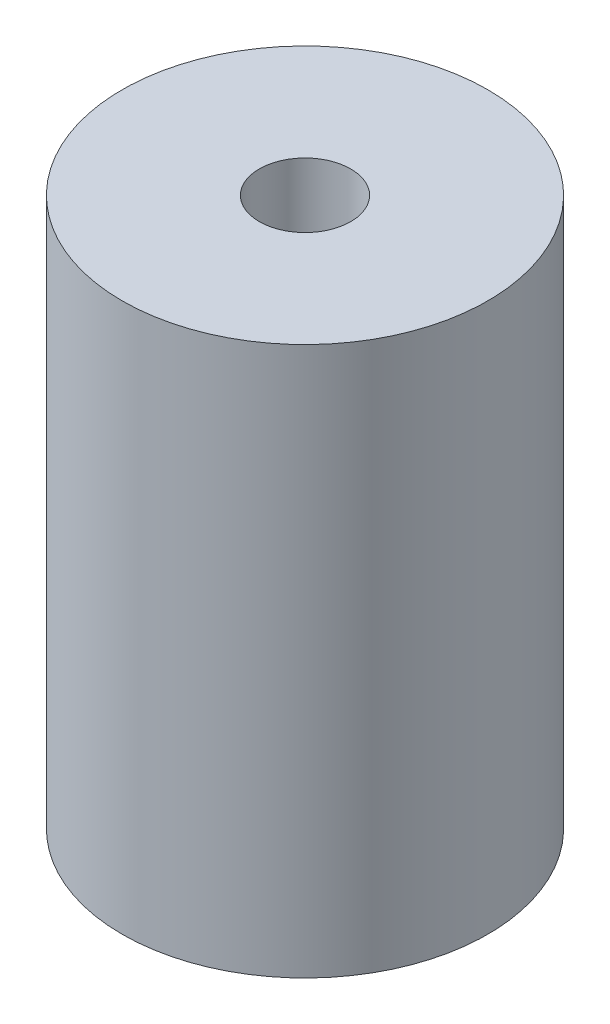
ISO-10303-21;
HEADER;
FILE_DESCRIPTION(('STEP AP214'),'2;1');
FILE_NAME('part.step','',(''),(''),'','','');
FILE_SCHEMA(('AUTOMOTIVE_DESIGN { 1 0 10303 214 1 1 1 1 }'));
ENDSEC;
DATA;
#1=APPLICATION_CONTEXT('core data for automotive mechanical design processes');
#2=APPLICATION_PROTOCOL_DEFINITION('international standard','automotive_design',2000,#1);
#3=PRODUCT_CONTEXT('',#1,'mechanical');
#4=PRODUCT('Part','Part','',(#3));
#5=PRODUCT_RELATED_PRODUCT_CATEGORY('part','',(#4));
#6=PRODUCT_DEFINITION_FORMATION('','',#4);
#7=PRODUCT_DEFINITION_CONTEXT('part definition',#1,'design');
#8=PRODUCT_DEFINITION('design','',#6,#7);
#9=PRODUCT_DEFINITION_SHAPE('','',#8);
#10=(LENGTH_UNIT() NAMED_UNIT(*) SI_UNIT(.MILLI.,.METRE.));
#11=(NAMED_UNIT(*) PLANE_ANGLE_UNIT() SI_UNIT($,.RADIAN.));
#12=(NAMED_UNIT(*) SI_UNIT($,.STERADIAN.) SOLID_ANGLE_UNIT());
#13=UNCERTAINTY_MEASURE_WITH_UNIT(LENGTH_MEASURE(1.E-05),#10,'distance_accuracy_value','');
#14=(GEOMETRIC_REPRESENTATION_CONTEXT(3) GLOBAL_UNCERTAINTY_ASSIGNED_CONTEXT((#13)) GLOBAL_UNIT_ASSIGNED_CONTEXT((#10,
#11,#12)) REPRESENTATION_CONTEXT('',''));
#15=CARTESIAN_POINT('',(0.,0.,0.));
#16=DIRECTION('',(0.,0.,1.));
#17=DIRECTION('',(1.,0.,0.));
#18=AXIS2_PLACEMENT_3D('',#15,#16,#17);
#19=CARTESIAN_POINT('',(0.,30.,0.));
#20=DIRECTION('',(0.,-1.,0.));
#21=DIRECTION('',(0.,0.,-1.));
#22=AXIS2_PLACEMENT_3D('',#19,#20,#21);
#23=CYLINDRICAL_SURFACE('',#22,10.);
#24=CARTESIAN_POINT('',(0.,30.,0.));
#25=DIRECTION('',(0.,1.,0.));
#26=DIRECTION('',(0.,0.,1.));
#27=AXIS2_PLACEMENT_3D('',#24,#25,#26);
#28=CIRCLE('',#27,10.);
#29=CARTESIAN_POINT('',(0.,30.,10.));
#30=VERTEX_POINT('',#29);
#31=EDGE_CURVE('E10',#30,#30,#28,.T.);
#32=ORIENTED_EDGE('',*,*,#31,.F.);
#33=EDGE_LOOP('',(#32));
#34=FACE_BOUND('',#33,.T.);
#35=CARTESIAN_POINT('',(0.,0.,0.));
#36=DIRECTION('',(0.,1.,0.));
#37=DIRECTION('',(0.,0.,1.));
#38=AXIS2_PLACEMENT_3D('',#35,#36,#37);
#39=CIRCLE('',#38,10.);
#40=CARTESIAN_POINT('',(0.,0.,10.));
#41=VERTEX_POINT('',#40);
#42=EDGE_CURVE('E34',#41,#41,#39,.T.);
#43=ORIENTED_EDGE('',*,*,#42,.T.);
#44=EDGE_LOOP('',(#43));
#45=FACE_BOUND('',#44,.T.);
#46=ADVANCED_FACE('F31',(#34,#45),#23,.T.);
#47=CARTESIAN_POINT('',(0.,30.,0.));
#48=DIRECTION('',(0.,1.,0.));
#49=DIRECTION('',(0.,0.,1.));
#50=AXIS2_PLACEMENT_3D('',#47,#48,#49);
#51=PLANE('',#50);
#52=CARTESIAN_POINT('',(0.,30.,0.));
#53=DIRECTION('',(0.,1.,0.));
#54=DIRECTION('',(0.,0.,1.));
#55=AXIS2_PLACEMENT_3D('',#52,#53,#54);
#56=CIRCLE('',#55,2.5);
#57=CARTESIAN_POINT('',(0.,30.,2.5));
#58=VERTEX_POINT('',#57);
#59=EDGE_CURVE('E43',#58,#58,#56,.T.);
#60=ORIENTED_EDGE('',*,*,#59,.F.);
#61=EDGE_LOOP('',(#60));
#62=FACE_BOUND('',#61,.T.);
#63=ORIENTED_EDGE('',*,*,#31,.T.);
#64=EDGE_LOOP('',(#63));
#65=FACE_BOUND('',#64,.T.);
#66=ADVANCED_FACE('F58',(#62,#65),#51,.T.);
#67=CARTESIAN_POINT('',(0.,0.,0.));
#68=DIRECTION('',(0.,1.,0.));
#69=DIRECTION('',(0.,0.,1.));
#70=AXIS2_PLACEMENT_3D('',#67,#68,#69);
#71=PLANE('',#70);
#72=CARTESIAN_POINT('',(0.,0.,0.));
#73=DIRECTION('',(0.,1.,0.));
#74=DIRECTION('',(0.,0.,1.));
#75=AXIS2_PLACEMENT_3D('',#72,#73,#74);
#76=CIRCLE('',#75,2.5);
#77=CARTESIAN_POINT('',(0.,0.,2.5));
#78=VERTEX_POINT('',#77);
#79=EDGE_CURVE('E41',#78,#78,#76,.T.);
#80=ORIENTED_EDGE('',*,*,#79,.T.);
#81=EDGE_LOOP('',(#80));
#82=FACE_BOUND('',#81,.T.);
#83=ORIENTED_EDGE('',*,*,#42,.F.);
#84=EDGE_LOOP('',(#83));
#85=FACE_BOUND('',#84,.T.);
#86=ADVANCED_FACE('F49',(#82,#85),#71,.F.);
#87=CARTESIAN_POINT('',(0.,0.,0.));
#88=DIRECTION('',(0.,1.,0.));
#89=DIRECTION('',(0.,0.,1.));
#90=AXIS2_PLACEMENT_3D('',#87,#88,#89);
#91=CYLINDRICAL_SURFACE('',#90,2.5);
#92=ORIENTED_EDGE('',*,*,#79,.F.);
#93=EDGE_LOOP('',(#92));
#94=FACE_BOUND('',#93,.T.);
#95=ORIENTED_EDGE('',*,*,#59,.T.);
#96=EDGE_LOOP('',(#95));
#97=FACE_BOUND('',#96,.T.);
#98=ADVANCED_FACE('F52',(#94,#97),#91,.F.);
#99=CLOSED_SHELL('',(#46,#66,#86,#98));
#100=MANIFOLD_SOLID_BREP('B2',#99);
#101=ADVANCED_BREP_SHAPE_REPRESENTATION('',(#18,#100),#14);
#102=SHAPE_DEFINITION_REPRESENTATION(#9,#101);
ENDSEC;
END-ISO-10303-21;
